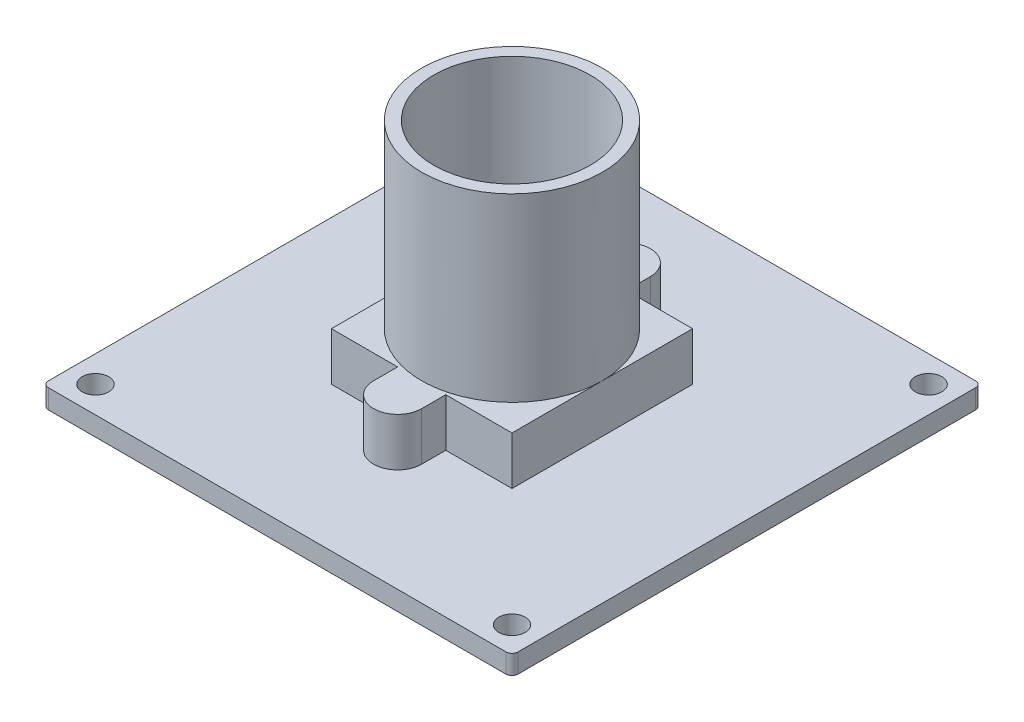
ISO-10303-21;
HEADER;
FILE_DESCRIPTION(('STEP AP214'),'2;1');
FILE_NAME('part.step','',(''),(''),'','','');
FILE_SCHEMA(('AUTOMOTIVE_DESIGN { 1 0 10303 214 1 1 1 1 }'));
ENDSEC;
DATA;
#1=APPLICATION_CONTEXT('core data for automotive mechanical design processes');
#2=APPLICATION_PROTOCOL_DEFINITION('international standard','automotive_design',2000,#1);
#3=PRODUCT_CONTEXT('',#1,'mechanical');
#4=PRODUCT('Part','Part','',(#3));
#5=PRODUCT_RELATED_PRODUCT_CATEGORY('part','',(#4));
#6=PRODUCT_DEFINITION_FORMATION('','',#4);
#7=PRODUCT_DEFINITION_CONTEXT('part definition',#1,'design');
#8=PRODUCT_DEFINITION('design','',#6,#7);
#9=PRODUCT_DEFINITION_SHAPE('','',#8);
#10=(LENGTH_UNIT() NAMED_UNIT(*) SI_UNIT(.MILLI.,.METRE.));
#11=(NAMED_UNIT(*) PLANE_ANGLE_UNIT() SI_UNIT($,.RADIAN.));
#12=(NAMED_UNIT(*) SI_UNIT($,.STERADIAN.) SOLID_ANGLE_UNIT());
#13=UNCERTAINTY_MEASURE_WITH_UNIT(LENGTH_MEASURE(1.E-05),#10,'distance_accuracy_value','');
#14=(GEOMETRIC_REPRESENTATION_CONTEXT(3) GLOBAL_UNCERTAINTY_ASSIGNED_CONTEXT((#13)) GLOBAL_UNIT_ASSIGNED_CONTEXT((#10,
#11,#12)) REPRESENTATION_CONTEXT('',''));
#15=CARTESIAN_POINT('',(0.,0.,0.));
#16=DIRECTION('',(0.,0.,1.));
#17=DIRECTION('',(1.,0.,0.));
#18=AXIS2_PLACEMENT_3D('',#15,#16,#17);
#19=CARTESIAN_POINT('',(0.,2.8,0.));
#20=DIRECTION('',(0.,1.,0.));
#21=DIRECTION('',(0.,0.,1.));
#22=AXIS2_PLACEMENT_3D('',#19,#20,#21);
#23=PLANE('',#22);
#24=DIRECTION('',(0.,0.,-1.));
#25=VECTOR('',#24,1.);
#26=CARTESIAN_POINT('',(3.5,2.8,-3.5));
#27=LINE('',#26,#25);
#28=CARTESIAN_POINT('',(3.5,2.8,3.5));
#29=VERTEX_POINT('',#28);
#30=CARTESIAN_POINT('',(3.5,2.8,-3.5));
#31=VERTEX_POINT('',#30);
#32=EDGE_CURVE('E484',#29,#31,#27,.T.);
#33=ORIENTED_EDGE('',*,*,#32,.T.);
#34=DIRECTION('',(-1.,0.,0.));
#35=VECTOR('',#34,1.);
#36=CARTESIAN_POINT('',(-3.5,2.8,-3.5));
#37=LINE('',#36,#35);
#38=CARTESIAN_POINT('',(-3.5,2.8,-3.5));
#39=VERTEX_POINT('',#38);
#40=EDGE_CURVE('E486',#31,#39,#37,.T.);
#41=ORIENTED_EDGE('',*,*,#40,.T.);
#42=DIRECTION('',(0.,0.,1.));
#43=VECTOR('',#42,1.);
#44=CARTESIAN_POINT('',(-3.5,2.8,-3.5));
#45=LINE('',#44,#43);
#46=CARTESIAN_POINT('',(-3.5,2.8,3.5));
#47=VERTEX_POINT('',#46);
#48=EDGE_CURVE('E489',#39,#47,#45,.T.);
#49=ORIENTED_EDGE('',*,*,#48,.T.);
#50=DIRECTION('',(1.,0.,0.));
#51=VECTOR('',#50,1.);
#52=CARTESIAN_POINT('',(-3.5,2.8,3.5));
#53=LINE('',#52,#51);
#54=EDGE_CURVE('E491',#47,#29,#53,.T.);
#55=ORIENTED_EDGE('',*,*,#54,.T.);
#56=EDGE_LOOP('',(#33,#41,#49,#55));
#57=FACE_BOUND('',#56,.T.);
#58=ADVANCED_FACE('F37',(#57),#23,.T.);
#59=CARTESIAN_POINT('',(-3.5,2.8,-3.5));
#60=DIRECTION('',(1.,0.,0.));
#61=DIRECTION('',(0.,0.,-1.));
#62=AXIS2_PLACEMENT_3D('',#59,#60,#61);
#63=PLANE('',#62);
#64=DIRECTION('',(0.,0.,1.));
#65=VECTOR('',#64,1.);
#66=CARTESIAN_POINT('',(-3.5,0.8,-3.5));
#67=LINE('',#66,#65);
#68=CARTESIAN_POINT('',(-3.5,0.8,-3.5));
#69=VERTEX_POINT('',#68);
#70=CARTESIAN_POINT('',(-3.5,0.8,3.5));
#71=VERTEX_POINT('',#70);
#72=EDGE_CURVE('E498',#69,#71,#67,.T.);
#73=ORIENTED_EDGE('',*,*,#72,.T.);
#74=DIRECTION('',(0.,-1.,0.));
#75=VECTOR('',#74,1.);
#76=CARTESIAN_POINT('',(-3.5,2.8,3.5));
#77=LINE('',#76,#75);
#78=EDGE_CURVE('E504',#47,#71,#77,.T.);
#79=ORIENTED_EDGE('',*,*,#78,.F.);
#80=ORIENTED_EDGE('',*,*,#48,.F.);
#81=DIRECTION('',(0.,-1.,0.));
#82=VECTOR('',#81,1.);
#83=CARTESIAN_POINT('',(-3.5,2.8,-3.5));
#84=LINE('',#83,#82);
#85=EDGE_CURVE('E506',#39,#69,#84,.T.);
#86=ORIENTED_EDGE('',*,*,#85,.T.);
#87=EDGE_LOOP('',(#73,#79,#80,#86));
#88=FACE_BOUND('',#87,.T.);
#89=ADVANCED_FACE('F270',(#88),#63,.F.);
#90=CARTESIAN_POINT('',(-3.5,2.8,3.5));
#91=DIRECTION('',(0.,0.,-1.));
#92=DIRECTION('',(-1.,0.,0.));
#93=AXIS2_PLACEMENT_3D('',#90,#91,#92);
#94=PLANE('',#93);
#95=DIRECTION('',(1.,0.,0.));
#96=VECTOR('',#95,1.);
#97=CARTESIAN_POINT('',(-3.5,0.8,3.5));
#98=LINE('',#97,#96);
#99=CARTESIAN_POINT('',(3.5,0.8,3.5));
#100=VERTEX_POINT('',#99);
#101=EDGE_CURVE('E487',#71,#100,#98,.T.);
#102=ORIENTED_EDGE('',*,*,#101,.T.);
#103=DIRECTION('',(0.,-1.,0.));
#104=VECTOR('',#103,1.);
#105=CARTESIAN_POINT('',(3.5,2.8,3.5));
#106=LINE('',#105,#104);
#107=EDGE_CURVE('E493',#29,#100,#106,.T.);
#108=ORIENTED_EDGE('',*,*,#107,.F.);
#109=ORIENTED_EDGE('',*,*,#54,.F.);
#110=ORIENTED_EDGE('',*,*,#78,.T.);
#111=EDGE_LOOP('',(#102,#108,#109,#110));
#112=FACE_BOUND('',#111,.T.);
#113=ADVANCED_FACE('F277',(#112),#94,.F.);
#114=CARTESIAN_POINT('',(3.5,2.8,-3.5));
#115=DIRECTION('',(-1.,0.,0.));
#116=DIRECTION('',(0.,0.,1.));
#117=AXIS2_PLACEMENT_3D('',#114,#115,#116);
#118=PLANE('',#117);
#119=DIRECTION('',(0.,0.,-1.));
#120=VECTOR('',#119,1.);
#121=CARTESIAN_POINT('',(3.5,0.8,-3.5));
#122=LINE('',#121,#120);
#123=CARTESIAN_POINT('',(3.5,0.8,-3.5));
#124=VERTEX_POINT('',#123);
#125=EDGE_CURVE('E483',#100,#124,#122,.T.);
#126=ORIENTED_EDGE('',*,*,#125,.T.);
#127=DIRECTION('',(0.,-1.,0.));
#128=VECTOR('',#127,1.);
#129=CARTESIAN_POINT('',(3.5,2.8,-3.5));
#130=LINE('',#129,#128);
#131=EDGE_CURVE('E509',#31,#124,#130,.T.);
#132=ORIENTED_EDGE('',*,*,#131,.F.);
#133=ORIENTED_EDGE('',*,*,#32,.F.);
#134=ORIENTED_EDGE('',*,*,#107,.T.);
#135=EDGE_LOOP('',(#126,#132,#133,#134));
#136=FACE_BOUND('',#135,.T.);
#137=ADVANCED_FACE('F286',(#136),#118,.F.);
#138=CARTESIAN_POINT('',(-3.5,2.8,-3.5));
#139=DIRECTION('',(0.,0.,1.));
#140=DIRECTION('',(1.,0.,0.));
#141=AXIS2_PLACEMENT_3D('',#138,#139,#140);
#142=PLANE('',#141);
#143=DIRECTION('',(-1.,0.,0.));
#144=VECTOR('',#143,1.);
#145=CARTESIAN_POINT('',(-3.5,0.8,-3.5));
#146=LINE('',#145,#144);
#147=EDGE_CURVE('E496',#124,#69,#146,.T.);
#148=ORIENTED_EDGE('',*,*,#147,.T.);
#149=ORIENTED_EDGE('',*,*,#85,.F.);
#150=ORIENTED_EDGE('',*,*,#40,.F.);
#151=ORIENTED_EDGE('',*,*,#131,.T.);
#152=EDGE_LOOP('',(#148,#149,#150,#151));
#153=FACE_BOUND('',#152,.T.);
#154=ADVANCED_FACE('F289',(#153),#142,.F.);
#155=CARTESIAN_POINT('',(0.,0.8,0.));
#156=DIRECTION('',(0.,1.,0.));
#157=DIRECTION('',(0.,0.,1.));
#158=AXIS2_PLACEMENT_3D('',#155,#156,#157);
#159=PLANE('',#158);
#160=DIRECTION('',(0.,0.,1.));
#161=VECTOR('',#160,1.);
#162=CARTESIAN_POINT('',(-7.,0.8,7.));
#163=LINE('',#162,#161);
#164=CARTESIAN_POINT('',(-7.,0.8,-7.));
#165=VERTEX_POINT('',#164);
#166=CARTESIAN_POINT('',(-7.,0.8,7.));
#167=VERTEX_POINT('',#166);
#168=EDGE_CURVE('E393',#165,#167,#163,.T.);
#169=ORIENTED_EDGE('',*,*,#168,.T.);
#170=DIRECTION('',(1.,0.,0.));
#171=VECTOR('',#170,1.);
#172=CARTESIAN_POINT('',(7.,0.8,7.));
#173=LINE('',#172,#171);
#174=CARTESIAN_POINT('',(7.,0.8,7.));
#175=VERTEX_POINT('',#174);
#176=EDGE_CURVE('E699',#167,#175,#173,.T.);
#177=ORIENTED_EDGE('',*,*,#176,.T.);
#178=DIRECTION('',(0.,0.,-1.));
#179=VECTOR('',#178,1.);
#180=CARTESIAN_POINT('',(7.,0.8,7.));
#181=LINE('',#180,#179);
#182=CARTESIAN_POINT('',(7.,0.8,-7.));
#183=VERTEX_POINT('',#182);
#184=EDGE_CURVE('E398',#175,#183,#181,.T.);
#185=ORIENTED_EDGE('',*,*,#184,.T.);
#186=DIRECTION('',(-1.,0.,0.));
#187=VECTOR('',#186,1.);
#188=CARTESIAN_POINT('',(7.,0.8,-7.));
#189=LINE('',#188,#187);
#190=EDGE_CURVE('E394',#183,#165,#189,.T.);
#191=ORIENTED_EDGE('',*,*,#190,.T.);
#192=EDGE_LOOP('',(#169,#177,#185,#191));
#193=FACE_BOUND('',#192,.T.);
#194=ORIENTED_EDGE('',*,*,#147,.F.);
#195=ORIENTED_EDGE('',*,*,#125,.F.);
#196=ORIENTED_EDGE('',*,*,#101,.F.);
#197=ORIENTED_EDGE('',*,*,#72,.F.);
#198=EDGE_LOOP('',(#194,#195,#196,#197));
#199=FACE_BOUND('',#198,.T.);
#200=ADVANCED_FACE('F292',(#193,#199),#159,.T.);
#201=CARTESIAN_POINT('',(7.,4.8,-7.));
#202=DIRECTION('',(0.,0.,1.));
#203=DIRECTION('',(1.,0.,0.));
#204=AXIS2_PLACEMENT_3D('',#201,#202,#203);
#205=PLANE('',#204);
#206=DIRECTION('',(0.,-1.,0.));
#207=VECTOR('',#206,1.);
#208=CARTESIAN_POINT('',(7.,4.8,-7.));
#209=LINE('',#208,#207);
#210=CARTESIAN_POINT('',(7.,4.7,-7.));
#211=VERTEX_POINT('',#210);
#212=EDGE_CURVE('E386',#211,#183,#209,.T.);
#213=ORIENTED_EDGE('',*,*,#212,.F.);
#214=DIRECTION('',(-1.,0.,0.));
#215=VECTOR('',#214,1.);
#216=CARTESIAN_POINT('',(7.,4.7,-7.));
#217=LINE('',#216,#215);
#218=CARTESIAN_POINT('',(-7.,4.7,-7.));
#219=VERTEX_POINT('',#218);
#220=EDGE_CURVE('E41',#211,#219,#217,.T.);
#221=ORIENTED_EDGE('',*,*,#220,.T.);
#222=DIRECTION('',(0.,-1.,0.));
#223=VECTOR('',#222,1.);
#224=CARTESIAN_POINT('',(-7.,4.8,-7.));
#225=LINE('',#224,#223);
#226=EDGE_CURVE('E384',#219,#165,#225,.T.);
#227=ORIENTED_EDGE('',*,*,#226,.T.);
#228=ORIENTED_EDGE('',*,*,#190,.F.);
#229=EDGE_LOOP('',(#213,#221,#227,#228));
#230=FACE_BOUND('',#229,.T.);
#231=ADVANCED_FACE('F315',(#230),#205,.T.);
#232=CARTESIAN_POINT('',(7.,4.8,7.));
#233=DIRECTION('',(-1.,0.,0.));
#234=DIRECTION('',(0.,0.,1.));
#235=AXIS2_PLACEMENT_3D('',#232,#233,#234);
#236=PLANE('',#235);
#237=DIRECTION('',(0.,-1.,0.));
#238=VECTOR('',#237,1.);
#239=CARTESIAN_POINT('',(7.,4.8,7.));
#240=LINE('',#239,#238);
#241=CARTESIAN_POINT('',(7.,4.7,7.));
#242=VERTEX_POINT('',#241);
#243=EDGE_CURVE('E396',#242,#175,#240,.T.);
#244=ORIENTED_EDGE('',*,*,#243,.F.);
#245=DIRECTION('',(0.,0.,-1.));
#246=VECTOR('',#245,1.);
#247=CARTESIAN_POINT('',(7.,4.7,7.));
#248=LINE('',#247,#246);
#249=EDGE_CURVE('E691',#242,#211,#248,.T.);
#250=ORIENTED_EDGE('',*,*,#249,.T.);
#251=ORIENTED_EDGE('',*,*,#212,.T.);
#252=ORIENTED_EDGE('',*,*,#184,.F.);
#253=EDGE_LOOP('',(#244,#250,#251,#252));
#254=FACE_BOUND('',#253,.T.);
#255=ADVANCED_FACE('F668',(#254),#236,.T.);
#256=CARTESIAN_POINT('',(7.,4.8,7.));
#257=DIRECTION('',(0.,0.,-1.));
#258=DIRECTION('',(-1.,0.,0.));
#259=AXIS2_PLACEMENT_3D('',#256,#257,#258);
#260=PLANE('',#259);
#261=DIRECTION('',(0.,-1.,0.));
#262=VECTOR('',#261,1.);
#263=CARTESIAN_POINT('',(-7.,4.8,7.));
#264=LINE('',#263,#262);
#265=CARTESIAN_POINT('',(-6.99999999999999,4.7,7.));
#266=VERTEX_POINT('',#265);
#267=EDGE_CURVE('E403',#266,#167,#264,.T.);
#268=ORIENTED_EDGE('',*,*,#267,.F.);
#269=DIRECTION('',(1.,0.,0.));
#270=VECTOR('',#269,1.);
#271=CARTESIAN_POINT('',(7.,4.7,7.));
#272=LINE('',#271,#270);
#273=EDGE_CURVE('E694',#266,#242,#272,.T.);
#274=ORIENTED_EDGE('',*,*,#273,.T.);
#275=ORIENTED_EDGE('',*,*,#243,.T.);
#276=ORIENTED_EDGE('',*,*,#176,.F.);
#277=EDGE_LOOP('',(#268,#274,#275,#276));
#278=FACE_BOUND('',#277,.T.);
#279=ADVANCED_FACE('F665',(#278),#260,.T.);
#280=CARTESIAN_POINT('',(-7.,4.8,7.));
#281=DIRECTION('',(1.,0.,0.));
#282=DIRECTION('',(0.,0.,-1.));
#283=AXIS2_PLACEMENT_3D('',#280,#281,#282);
#284=PLANE('',#283);
#285=ORIENTED_EDGE('',*,*,#226,.F.);
#286=DIRECTION('',(0.,0.,1.));
#287=VECTOR('',#286,1.);
#288=CARTESIAN_POINT('',(-7.,4.7,7.));
#289=LINE('',#288,#287);
#290=EDGE_CURVE('E60',#219,#266,#289,.T.);
#291=ORIENTED_EDGE('',*,*,#290,.T.);
#292=ORIENTED_EDGE('',*,*,#267,.T.);
#293=ORIENTED_EDGE('',*,*,#168,.F.);
#294=EDGE_LOOP('',(#285,#291,#292,#293));
#295=FACE_BOUND('',#294,.T.);
#296=ADVANCED_FACE('F390',(#295),#284,.T.);
#297=CARTESIAN_POINT('',(0.,4.7,0.));
#298=DIRECTION('',(0.,1.,0.));
#299=DIRECTION('',(0.,0.,1.));
#300=AXIS2_PLACEMENT_3D('',#297,#298,#299);
#301=PLANE('',#300);
#302=CARTESIAN_POINT('',(0.,4.7,0.));
#303=DIRECTION('',(0.,1.,0.));
#304=DIRECTION('',(0.,0.,1.));
#305=AXIS2_PLACEMENT_3D('',#302,#303,#304);
#306=CIRCLE('',#305,6.5);
#307=CARTESIAN_POINT('',(0.,4.7,6.5));
#308=VERTEX_POINT('',#307);
#309=EDGE_CURVE('E250',#308,#308,#306,.T.);
#310=ORIENTED_EDGE('',*,*,#309,.T.);
#311=EDGE_LOOP('',(#310));
#312=FACE_BOUND('',#311,.T.);
#313=ORIENTED_EDGE('',*,*,#290,.F.);
#314=ORIENTED_EDGE('',*,*,#220,.F.);
#315=ORIENTED_EDGE('',*,*,#249,.F.);
#316=ORIENTED_EDGE('',*,*,#273,.F.);
#317=EDGE_LOOP('',(#313,#314,#315,#316));
#318=FACE_BOUND('',#317,.T.);
#319=ADVANCED_FACE('F664',(#312,#318),#301,.F.);
#320=CARTESIAN_POINT('',(0.,19.8,0.));
#321=DIRECTION('',(0.,1.,0.));
#322=DIRECTION('',(0.,0.,1.));
#323=AXIS2_PLACEMENT_3D('',#320,#321,#322);
#324=CYLINDRICAL_SURFACE('',#323,6.5);
#325=ORIENTED_EDGE('',*,*,#309,.F.);
#326=EDGE_LOOP('',(#325));
#327=FACE_BOUND('',#326,.T.);
#328=CARTESIAN_POINT('',(0.,19.8,0.));
#329=DIRECTION('',(0.,1.,0.));
#330=DIRECTION('',(0.,0.,1.));
#331=AXIS2_PLACEMENT_3D('',#328,#329,#330);
#332=CIRCLE('',#331,6.5);
#333=CARTESIAN_POINT('',(0.,19.8,6.5));
#334=VERTEX_POINT('',#333);
#335=EDGE_CURVE('E685',#334,#334,#332,.T.);
#336=ORIENTED_EDGE('',*,*,#335,.T.);
#337=EDGE_LOOP('',(#336));
#338=FACE_BOUND('',#337,.T.);
#339=ADVANCED_FACE('F675',(#327,#338),#324,.F.);
#340=CARTESIAN_POINT('',(0.,4.8,-9.5));
#341=DIRECTION('',(0.,1.,0.));
#342=DIRECTION('',(0.,0.,1.));
#343=AXIS2_PLACEMENT_3D('',#340,#341,#342);
#344=PLANE('',#343);
#345=CARTESIAN_POINT('',(0.,4.8,0.));
#346=DIRECTION('',(0.,1.,0.));
#347=DIRECTION('',(0.,0.,1.));
#348=AXIS2_PLACEMENT_3D('',#345,#346,#347);
#349=CIRCLE('',#348,7.5);
#350=CARTESIAN_POINT('',(7.5,4.8,0.));
#351=VERTEX_POINT('',#350);
#352=CARTESIAN_POINT('',(-7.5,4.8,0.));
#353=VERTEX_POINT('',#352);
#354=EDGE_CURVE('E47',#351,#353,#349,.T.);
#355=ORIENTED_EDGE('',*,*,#354,.F.);
#356=DIRECTION('',(0.,0.,-1.));
#357=VECTOR('',#356,1.);
#358=CARTESIAN_POINT('',(7.5,4.8,-7.5));
#359=LINE('',#358,#357);
#360=CARTESIAN_POINT('',(7.5,4.8,-7.5));
#361=VERTEX_POINT('',#360);
#362=EDGE_CURVE('E234',#351,#361,#359,.T.);
#363=ORIENTED_EDGE('',*,*,#362,.T.);
#364=DIRECTION('',(-1.,0.,0.));
#365=VECTOR('',#364,1.);
#366=CARTESIAN_POINT('',(2.,4.8,-7.5));
#367=LINE('',#366,#365);
#368=CARTESIAN_POINT('',(2.,4.8,-7.5));
#369=VERTEX_POINT('',#368);
#370=EDGE_CURVE('E233',#361,#369,#367,.T.);
#371=ORIENTED_EDGE('',*,*,#370,.T.);
#372=DIRECTION('',(0.,0.,-1.));
#373=VECTOR('',#372,1.);
#374=CARTESIAN_POINT('',(2.,4.8,-9.5));
#375=LINE('',#374,#373);
#376=CARTESIAN_POINT('',(2.,4.8,-9.5));
#377=VERTEX_POINT('',#376);
#378=EDGE_CURVE('E409',#369,#377,#375,.T.);
#379=ORIENTED_EDGE('',*,*,#378,.T.);
#380=CARTESIAN_POINT('',(0.,4.8,-9.5));
#381=DIRECTION('',(0.,1.,0.));
#382=DIRECTION('',(0.,0.,1.));
#383=AXIS2_PLACEMENT_3D('',#380,#381,#382);
#384=CIRCLE('',#383,2.);
#385=CARTESIAN_POINT('',(-2.,4.8,-9.5));
#386=VERTEX_POINT('',#385);
#387=EDGE_CURVE('E411',#377,#386,#384,.T.);
#388=ORIENTED_EDGE('',*,*,#387,.T.);
#389=DIRECTION('',(0.,0.,1.));
#390=VECTOR('',#389,1.);
#391=CARTESIAN_POINT('',(-2.,4.8,-9.5));
#392=LINE('',#391,#390);
#393=CARTESIAN_POINT('',(-2.,4.8,-7.5));
#394=VERTEX_POINT('',#393);
#395=EDGE_CURVE('E413',#386,#394,#392,.T.);
#396=ORIENTED_EDGE('',*,*,#395,.T.);
#397=DIRECTION('',(-1.,0.,0.));
#398=VECTOR('',#397,1.);
#399=CARTESIAN_POINT('',(-7.5,4.8,-7.5));
#400=LINE('',#399,#398);
#401=CARTESIAN_POINT('',(-7.5,4.8,-7.5));
#402=VERTEX_POINT('',#401);
#403=EDGE_CURVE('E415',#394,#402,#400,.T.);
#404=ORIENTED_EDGE('',*,*,#403,.T.);
#405=DIRECTION('',(0.,0.,1.));
#406=VECTOR('',#405,1.);
#407=CARTESIAN_POINT('',(-7.5,4.8,-7.5));
#408=LINE('',#407,#406);
#409=EDGE_CURVE('E247',#402,#353,#408,.T.);
#410=ORIENTED_EDGE('',*,*,#409,.T.);
#411=EDGE_LOOP('',(#355,#363,#371,#379,#388,#396,#404,#410));
#412=FACE_BOUND('',#411,.T.);
#413=ADVANCED_FACE('F245',(#412),#344,.T.);
#414=CARTESIAN_POINT('',(17.3,0.8,-17.3));
#415=DIRECTION('',(0.,1.,0.));
#416=DIRECTION('',(0.,0.,-1.));
#417=AXIS2_PLACEMENT_3D('',#414,#415,#416);
#418=CIRCLE('',#417,1.1);
#419=CARTESIAN_POINT('',(17.3,0.8,-18.4));
#420=VERTEX_POINT('',#419);
#421=EDGE_CURVE('E511',#420,#420,#418,.T.);
#422=ORIENTED_EDGE('',*,*,#421,.F.);
#423=EDGE_LOOP('',(#422));
#424=FACE_BOUND('',#423,.T.);
#425=CARTESIAN_POINT('',(17.3,0.8,17.3));
#426=DIRECTION('',(0.,1.,0.));
#427=DIRECTION('',(0.,0.,1.));
#428=AXIS2_PLACEMENT_3D('',#425,#426,#427);
#429=CIRCLE('',#428,1.1);
#430=CARTESIAN_POINT('',(17.3,0.8,18.4));
#431=VERTEX_POINT('',#430);
#432=EDGE_CURVE('E522',#431,#431,#429,.T.);
#433=ORIENTED_EDGE('',*,*,#432,.F.);
#434=EDGE_LOOP('',(#433));
#435=FACE_BOUND('',#434,.T.);
#436=CARTESIAN_POINT('',(-17.3,0.8,17.3));
#437=DIRECTION('',(0.,1.,0.));
#438=DIRECTION('',(0.,0.,-1.));
#439=AXIS2_PLACEMENT_3D('',#436,#437,#438);
#440=CIRCLE('',#439,1.1);
#441=CARTESIAN_POINT('',(-17.3,0.8,16.2));
#442=VERTEX_POINT('',#441);
#443=EDGE_CURVE('E516',#442,#442,#440,.T.);
#444=ORIENTED_EDGE('',*,*,#443,.F.);
#445=EDGE_LOOP('',(#444));
#446=FACE_BOUND('',#445,.T.);
#447=CARTESIAN_POINT('',(-17.3,0.8,-17.3));
#448=DIRECTION('',(0.,1.,0.));
#449=DIRECTION('',(0.,0.,1.));
#450=AXIS2_PLACEMENT_3D('',#447,#448,#449);
#451=CIRCLE('',#450,1.1);
#452=CARTESIAN_POINT('',(-17.3,0.8,-16.2));
#453=VERTEX_POINT('',#452);
#454=EDGE_CURVE('E515',#453,#453,#451,.T.);
#455=ORIENTED_EDGE('',*,*,#454,.F.);
#456=EDGE_LOOP('',(#455));
#457=FACE_BOUND('',#456,.T.);
#458=DIRECTION('',(0.,0.,1.));
#459=VECTOR('',#458,1.);
#460=CARTESIAN_POINT('',(-19.5,0.8,-19.5));
#461=LINE('',#460,#459);
#462=CARTESIAN_POINT('',(-19.5,0.8,-19.));
#463=VERTEX_POINT('',#462);
#464=CARTESIAN_POINT('',(-19.5,0.8,19.));
#465=VERTEX_POINT('',#464);
#466=EDGE_CURVE('E541',#463,#465,#461,.T.);
#467=ORIENTED_EDGE('',*,*,#466,.T.);
#468=CARTESIAN_POINT('',(-19.,0.8,19.));
#469=DIRECTION('',(0.,1.,0.));
#470=DIRECTION('',(0.,0.,1.));
#471=AXIS2_PLACEMENT_3D('',#468,#469,#470);
#472=CIRCLE('',#471,0.5);
#473=CARTESIAN_POINT('',(-19.,0.8,19.5));
#474=VERTEX_POINT('',#473);
#475=EDGE_CURVE('E366',#465,#474,#472,.T.);
#476=ORIENTED_EDGE('',*,*,#475,.T.);
#477=DIRECTION('',(1.,0.,0.));
#478=VECTOR('',#477,1.);
#479=CARTESIAN_POINT('',(-19.5,0.8,19.5));
#480=LINE('',#479,#478);
#481=CARTESIAN_POINT('',(19.,0.8,19.5));
#482=VERTEX_POINT('',#481);
#483=EDGE_CURVE('E544',#474,#482,#480,.T.);
#484=ORIENTED_EDGE('',*,*,#483,.T.);
#485=CARTESIAN_POINT('',(19.,0.8,19.));
#486=DIRECTION('',(0.,1.,0.));
#487=DIRECTION('',(0.,0.,1.));
#488=AXIS2_PLACEMENT_3D('',#485,#486,#487);
#489=CIRCLE('',#488,0.5);
#490=CARTESIAN_POINT('',(19.5,0.8,19.));
#491=VERTEX_POINT('',#490);
#492=EDGE_CURVE('E363',#482,#491,#489,.T.);
#493=ORIENTED_EDGE('',*,*,#492,.T.);
#494=DIRECTION('',(0.,0.,-1.));
#495=VECTOR('',#494,1.);
#496=CARTESIAN_POINT('',(19.5,0.8,-19.5));
#497=LINE('',#496,#495);
#498=CARTESIAN_POINT('',(19.5,0.8,-19.));
#499=VERTEX_POINT('',#498);
#500=EDGE_CURVE('E536',#491,#499,#497,.T.);
#501=ORIENTED_EDGE('',*,*,#500,.T.);
#502=CARTESIAN_POINT('',(19.,0.8,-19.));
#503=DIRECTION('',(0.,1.,0.));
#504=DIRECTION('',(0.,0.,1.));
#505=AXIS2_PLACEMENT_3D('',#502,#503,#504);
#506=CIRCLE('',#505,0.5);
#507=CARTESIAN_POINT('',(19.,0.8,-19.5));
#508=VERTEX_POINT('',#507);
#509=EDGE_CURVE('E355',#499,#508,#506,.T.);
#510=ORIENTED_EDGE('',*,*,#509,.T.);
#511=DIRECTION('',(-1.,0.,0.));
#512=VECTOR('',#511,1.);
#513=CARTESIAN_POINT('',(-19.5,0.8,-19.5));
#514=LINE('',#513,#512);
#515=CARTESIAN_POINT('',(-19.,0.8,-19.5));
#516=VERTEX_POINT('',#515);
#517=EDGE_CURVE('E538',#508,#516,#514,.T.);
#518=ORIENTED_EDGE('',*,*,#517,.T.);
#519=CARTESIAN_POINT('',(-19.,0.8,-19.));
#520=DIRECTION('',(0.,1.,0.));
#521=DIRECTION('',(0.,0.,1.));
#522=AXIS2_PLACEMENT_3D('',#519,#520,#521);
#523=CIRCLE('',#522,0.5);
#524=EDGE_CURVE('E364',#516,#463,#523,.T.);
#525=ORIENTED_EDGE('',*,*,#524,.T.);
#526=EDGE_LOOP('',(#467,#476,#484,#493,#501,#510,#518,#525));
#527=FACE_BOUND('',#526,.T.);
#528=DIRECTION('',(0.,0.,-1.));
#529=VECTOR('',#528,1.);
#530=CARTESIAN_POINT('',(7.5,0.8,-7.5));
#531=LINE('',#530,#529);
#532=CARTESIAN_POINT('',(7.5,0.8,7.5));
#533=VERTEX_POINT('',#532);
#534=CARTESIAN_POINT('',(7.5,0.8,-7.5));
#535=VERTEX_POINT('',#534);
#536=EDGE_CURVE('E430',#533,#535,#531,.T.);
#537=ORIENTED_EDGE('',*,*,#536,.F.);
#538=DIRECTION('',(1.,0.,0.));
#539=VECTOR('',#538,1.);
#540=CARTESIAN_POINT('',(1.99999999999999,0.8,7.5));
#541=LINE('',#540,#539);
#542=CARTESIAN_POINT('',(1.99999999999999,0.8,7.5));
#543=VERTEX_POINT('',#542);
#544=EDGE_CURVE('E405',#543,#533,#541,.T.);
#545=ORIENTED_EDGE('',*,*,#544,.F.);
#546=DIRECTION('',(0.,0.,-1.));
#547=VECTOR('',#546,1.);
#548=CARTESIAN_POINT('',(1.99999999999999,0.8,9.5));
#549=LINE('',#548,#547);
#550=CARTESIAN_POINT('',(1.99999999999999,0.8,9.5));
#551=VERTEX_POINT('',#550);
#552=EDGE_CURVE('E406',#551,#543,#549,.T.);
#553=ORIENTED_EDGE('',*,*,#552,.F.);
#554=CARTESIAN_POINT('',(0.,0.8,9.5));
#555=DIRECTION('',(0.,1.,0.));
#556=DIRECTION('',(0.,0.,-1.));
#557=AXIS2_PLACEMENT_3D('',#554,#555,#556);
#558=CIRCLE('',#557,2.);
#559=CARTESIAN_POINT('',(-2.00000000000001,0.8,9.5));
#560=VERTEX_POINT('',#559);
#561=EDGE_CURVE('E453',#560,#551,#558,.T.);
#562=ORIENTED_EDGE('',*,*,#561,.F.);
#563=DIRECTION('',(0.,0.,1.));
#564=VECTOR('',#563,1.);
#565=CARTESIAN_POINT('',(-2.00000000000001,0.8,9.5));
#566=LINE('',#565,#564);
#567=CARTESIAN_POINT('',(-2.00000000000001,0.8,7.5));
#568=VERTEX_POINT('',#567);
#569=EDGE_CURVE('E451',#568,#560,#566,.T.);
#570=ORIENTED_EDGE('',*,*,#569,.F.);
#571=DIRECTION('',(1.,0.,0.));
#572=VECTOR('',#571,1.);
#573=CARTESIAN_POINT('',(-7.5,0.8,7.5));
#574=LINE('',#573,#572);
#575=CARTESIAN_POINT('',(-7.5,0.8,7.5));
#576=VERTEX_POINT('',#575);
#577=EDGE_CURVE('E448',#576,#568,#574,.T.);
#578=ORIENTED_EDGE('',*,*,#577,.F.);
#579=DIRECTION('',(0.,0.,1.));
#580=VECTOR('',#579,1.);
#581=CARTESIAN_POINT('',(-7.5,0.8,-7.5));
#582=LINE('',#581,#580);
#583=CARTESIAN_POINT('',(-7.5,0.8,-7.5));
#584=VERTEX_POINT('',#583);
#585=EDGE_CURVE('E445',#584,#576,#582,.T.);
#586=ORIENTED_EDGE('',*,*,#585,.F.);
#587=DIRECTION('',(-1.,0.,0.));
#588=VECTOR('',#587,1.);
#589=CARTESIAN_POINT('',(-7.5,0.8,-7.5));
#590=LINE('',#589,#588);
#591=CARTESIAN_POINT('',(-2.,0.8,-7.5));
#592=VERTEX_POINT('',#591);
#593=EDGE_CURVE('E442',#592,#584,#590,.T.);
#594=ORIENTED_EDGE('',*,*,#593,.F.);
#595=DIRECTION('',(0.,0.,1.));
#596=VECTOR('',#595,1.);
#597=CARTESIAN_POINT('',(-2.,0.8,-9.5));
#598=LINE('',#597,#596);
#599=CARTESIAN_POINT('',(-2.,0.8,-9.5));
#600=VERTEX_POINT('',#599);
#601=EDGE_CURVE('E439',#600,#592,#598,.T.);
#602=ORIENTED_EDGE('',*,*,#601,.F.);
#603=CARTESIAN_POINT('',(0.,0.8,-9.5));
#604=DIRECTION('',(0.,1.,0.));
#605=DIRECTION('',(0.,0.,1.));
#606=AXIS2_PLACEMENT_3D('',#603,#604,#605);
#607=CIRCLE('',#606,2.);
#608=CARTESIAN_POINT('',(2.,0.8,-9.5));
#609=VERTEX_POINT('',#608);
#610=EDGE_CURVE('E437',#609,#600,#607,.T.);
#611=ORIENTED_EDGE('',*,*,#610,.F.);
#612=DIRECTION('',(0.,0.,-1.));
#613=VECTOR('',#612,1.);
#614=CARTESIAN_POINT('',(2.,0.8,-9.5));
#615=LINE('',#614,#613);
#616=CARTESIAN_POINT('',(2.,0.8,-7.5));
#617=VERTEX_POINT('',#616);
#618=EDGE_CURVE('E435',#617,#609,#615,.T.);
#619=ORIENTED_EDGE('',*,*,#618,.F.);
#620=DIRECTION('',(-1.,0.,0.));
#621=VECTOR('',#620,1.);
#622=CARTESIAN_POINT('',(2.,0.8,-7.5));
#623=LINE('',#622,#621);
#624=EDGE_CURVE('E432',#535,#617,#623,.T.);
#625=ORIENTED_EDGE('',*,*,#624,.F.);
#626=EDGE_LOOP('',(#537,#545,#553,#562,#570,#578,#586,#594,#602,#611,#619,#625));
#627=FACE_BOUND('',#626,.T.);
#628=ADVANCED_FACE('F317',(#424,#435,#446,#457,#527,#627),#159,.T.);
#629=CARTESIAN_POINT('',(19.5,0.8,-19.5));
#630=DIRECTION('',(-1.,0.,0.));
#631=DIRECTION('',(0.,0.,1.));
#632=AXIS2_PLACEMENT_3D('',#629,#630,#631);
#633=PLANE('',#632);
#634=ORIENTED_EDGE('',*,*,#500,.F.);
#635=DIRECTION('',(0.,-1.,0.));
#636=VECTOR('',#635,1.);
#637=CARTESIAN_POINT('',(19.5,0.8,19.));
#638=LINE('',#637,#636);
#639=CARTESIAN_POINT('',(19.5,-0.8,19.));
#640=VERTEX_POINT('',#639);
#641=EDGE_CURVE('E374',#491,#640,#638,.T.);
#642=ORIENTED_EDGE('',*,*,#641,.T.);
#643=DIRECTION('',(0.,0.,-1.));
#644=VECTOR('',#643,1.);
#645=CARTESIAN_POINT('',(19.5,-0.8,-19.5));
#646=LINE('',#645,#644);
#647=CARTESIAN_POINT('',(19.5,-0.8,-19.));
#648=VERTEX_POINT('',#647);
#649=EDGE_CURVE('E533',#640,#648,#646,.T.);
#650=ORIENTED_EDGE('',*,*,#649,.T.);
#651=DIRECTION('',(0.,-1.,0.));
#652=VECTOR('',#651,1.);
#653=CARTESIAN_POINT('',(19.5,0.8,-19.));
#654=LINE('',#653,#652);
#655=EDGE_CURVE('E356',#648,#499,#654,.F.);
#656=ORIENTED_EDGE('',*,*,#655,.T.);
#657=EDGE_LOOP('',(#634,#642,#650,#656));
#658=FACE_BOUND('',#657,.T.);
#659=ADVANCED_FACE('F334',(#658),#633,.F.);
#660=CARTESIAN_POINT('',(-19.5,0.8,-19.5));
#661=DIRECTION('',(0.,0.,1.));
#662=DIRECTION('',(1.,0.,0.));
#663=AXIS2_PLACEMENT_3D('',#660,#661,#662);
#664=PLANE('',#663);
#665=ORIENTED_EDGE('',*,*,#517,.F.);
#666=DIRECTION('',(0.,-1.,0.));
#667=VECTOR('',#666,1.);
#668=CARTESIAN_POINT('',(19.,0.8,-19.5));
#669=LINE('',#668,#667);
#670=CARTESIAN_POINT('',(19.,-0.8,-19.5));
#671=VERTEX_POINT('',#670);
#672=EDGE_CURVE('E358',#508,#671,#669,.T.);
#673=ORIENTED_EDGE('',*,*,#672,.T.);
#674=DIRECTION('',(-1.,0.,0.));
#675=VECTOR('',#674,1.);
#676=CARTESIAN_POINT('',(-19.5,-0.8,-19.5));
#677=LINE('',#676,#675);
#678=CARTESIAN_POINT('',(-19.,-0.8,-19.5));
#679=VERTEX_POINT('',#678);
#680=EDGE_CURVE('E550',#671,#679,#677,.T.);
#681=ORIENTED_EDGE('',*,*,#680,.T.);
#682=DIRECTION('',(0.,-1.,0.));
#683=VECTOR('',#682,1.);
#684=CARTESIAN_POINT('',(-19.,0.8,-19.5));
#685=LINE('',#684,#683);
#686=EDGE_CURVE('E377',#679,#516,#685,.F.);
#687=ORIENTED_EDGE('',*,*,#686,.T.);
#688=EDGE_LOOP('',(#665,#673,#681,#687));
#689=FACE_BOUND('',#688,.T.);
#690=ADVANCED_FACE('F330',(#689),#664,.F.);
#691=CARTESIAN_POINT('',(-19.5,0.8,-19.5));
#692=DIRECTION('',(1.,0.,0.));
#693=DIRECTION('',(0.,0.,-1.));
#694=AXIS2_PLACEMENT_3D('',#691,#692,#693);
#695=PLANE('',#694);
#696=DIRECTION('',(0.,0.,1.));
#697=VECTOR('',#696,1.);
#698=CARTESIAN_POINT('',(-19.5,-0.8,-19.5));
#699=LINE('',#698,#697);
#700=CARTESIAN_POINT('',(-19.5,-0.8,-19.));
#701=VERTEX_POINT('',#700);
#702=CARTESIAN_POINT('',(-19.5,-0.8,19.));
#703=VERTEX_POINT('',#702);
#704=EDGE_CURVE('E552',#701,#703,#699,.T.);
#705=ORIENTED_EDGE('',*,*,#704,.T.);
#706=DIRECTION('',(0.,-1.,0.));
#707=VECTOR('',#706,1.);
#708=CARTESIAN_POINT('',(-19.5,0.8,19.));
#709=LINE('',#708,#707);
#710=EDGE_CURVE('E368',#703,#465,#709,.F.);
#711=ORIENTED_EDGE('',*,*,#710,.T.);
#712=ORIENTED_EDGE('',*,*,#466,.F.);
#713=DIRECTION('',(0.,-1.,0.));
#714=VECTOR('',#713,1.);
#715=CARTESIAN_POINT('',(-19.5,0.8,-19.));
#716=LINE('',#715,#714);
#717=EDGE_CURVE('E569',#463,#701,#716,.T.);
#718=ORIENTED_EDGE('',*,*,#717,.T.);
#719=EDGE_LOOP('',(#705,#711,#712,#718));
#720=FACE_BOUND('',#719,.T.);
#721=ADVANCED_FACE('F326',(#720),#695,.F.);
#722=CARTESIAN_POINT('',(-19.5,0.8,19.5));
#723=DIRECTION('',(0.,0.,-1.));
#724=DIRECTION('',(-1.,0.,0.));
#725=AXIS2_PLACEMENT_3D('',#722,#723,#724);
#726=PLANE('',#725);
#727=ORIENTED_EDGE('',*,*,#483,.F.);
#728=DIRECTION('',(0.,-1.,0.));
#729=VECTOR('',#728,1.);
#730=CARTESIAN_POINT('',(-19.,0.8,19.5));
#731=LINE('',#730,#729);
#732=CARTESIAN_POINT('',(-19.,-0.8,19.5));
#733=VERTEX_POINT('',#732);
#734=EDGE_CURVE('E558',#474,#733,#731,.T.);
#735=ORIENTED_EDGE('',*,*,#734,.T.);
#736=DIRECTION('',(1.,0.,0.));
#737=VECTOR('',#736,1.);
#738=CARTESIAN_POINT('',(-19.5,-0.8,19.5));
#739=LINE('',#738,#737);
#740=CARTESIAN_POINT('',(19.,-0.8,19.5));
#741=VERTEX_POINT('',#740);
#742=EDGE_CURVE('E539',#733,#741,#739,.T.);
#743=ORIENTED_EDGE('',*,*,#742,.T.);
#744=DIRECTION('',(0.,-1.,0.));
#745=VECTOR('',#744,1.);
#746=CARTESIAN_POINT('',(19.,0.8,19.5));
#747=LINE('',#746,#745);
#748=EDGE_CURVE('E547',#741,#482,#747,.F.);
#749=ORIENTED_EDGE('',*,*,#748,.T.);
#750=EDGE_LOOP('',(#727,#735,#743,#749));
#751=FACE_BOUND('',#750,.T.);
#752=ADVANCED_FACE('F322',(#751),#726,.F.);
#753=CARTESIAN_POINT('',(0.,-0.8,0.));
#754=DIRECTION('',(0.,1.,0.));
#755=DIRECTION('',(0.,0.,1.));
#756=AXIS2_PLACEMENT_3D('',#753,#754,#755);
#757=PLANE('',#756);
#758=CARTESIAN_POINT('',(17.3,-0.8,-17.3));
#759=DIRECTION('',(0.,1.,0.));
#760=DIRECTION('',(0.,0.,-1.));
#761=AXIS2_PLACEMENT_3D('',#758,#759,#760);
#762=CIRCLE('',#761,1.1);
#763=CARTESIAN_POINT('',(17.3,-0.8,-18.4));
#764=VERTEX_POINT('',#763);
#765=EDGE_CURVE('E525',#764,#764,#762,.T.);
#766=ORIENTED_EDGE('',*,*,#765,.T.);
#767=EDGE_LOOP('',(#766));
#768=FACE_BOUND('',#767,.T.);
#769=CARTESIAN_POINT('',(17.3,-0.8,17.3));
#770=DIRECTION('',(0.,1.,0.));
#771=DIRECTION('',(0.,0.,1.));
#772=AXIS2_PLACEMENT_3D('',#769,#770,#771);
#773=CIRCLE('',#772,1.1);
#774=CARTESIAN_POINT('',(17.3,-0.8,18.4));
#775=VERTEX_POINT('',#774);
#776=EDGE_CURVE('E519',#775,#775,#773,.T.);
#777=ORIENTED_EDGE('',*,*,#776,.T.);
#778=EDGE_LOOP('',(#777));
#779=FACE_BOUND('',#778,.T.);
#780=CARTESIAN_POINT('',(-17.3,-0.8,17.3));
#781=DIRECTION('',(0.,1.,0.));
#782=DIRECTION('',(0.,0.,-1.));
#783=AXIS2_PLACEMENT_3D('',#780,#781,#782);
#784=CIRCLE('',#783,1.1);
#785=CARTESIAN_POINT('',(-17.3,-0.8,16.2));
#786=VERTEX_POINT('',#785);
#787=EDGE_CURVE('E512',#786,#786,#784,.T.);
#788=ORIENTED_EDGE('',*,*,#787,.T.);
#789=EDGE_LOOP('',(#788));
#790=FACE_BOUND('',#789,.T.);
#791=CARTESIAN_POINT('',(-17.3,-0.8,-17.3));
#792=DIRECTION('',(0.,1.,0.));
#793=DIRECTION('',(0.,0.,1.));
#794=AXIS2_PLACEMENT_3D('',#791,#792,#793);
#795=CIRCLE('',#794,1.1);
#796=CARTESIAN_POINT('',(-17.3,-0.8,-16.2));
#797=VERTEX_POINT('',#796);
#798=EDGE_CURVE('E530',#797,#797,#795,.T.);
#799=ORIENTED_EDGE('',*,*,#798,.T.);
#800=EDGE_LOOP('',(#799));
#801=FACE_BOUND('',#800,.T.);
#802=ORIENTED_EDGE('',*,*,#742,.F.);
#803=CARTESIAN_POINT('',(-19.,-0.8,19.));
#804=DIRECTION('',(0.,1.,0.));
#805=DIRECTION('',(0.,0.,1.));
#806=AXIS2_PLACEMENT_3D('',#803,#804,#805);
#807=CIRCLE('',#806,0.5);
#808=EDGE_CURVE('E567',#733,#703,#807,.F.);
#809=ORIENTED_EDGE('',*,*,#808,.T.);
#810=ORIENTED_EDGE('',*,*,#704,.F.);
#811=CARTESIAN_POINT('',(-19.,-0.8,-19.));
#812=DIRECTION('',(0.,1.,0.));
#813=DIRECTION('',(0.,0.,1.));
#814=AXIS2_PLACEMENT_3D('',#811,#812,#813);
#815=CIRCLE('',#814,0.5);
#816=EDGE_CURVE('E561',#701,#679,#815,.F.);
#817=ORIENTED_EDGE('',*,*,#816,.T.);
#818=ORIENTED_EDGE('',*,*,#680,.F.);
#819=CARTESIAN_POINT('',(19.,-0.8,-19.));
#820=DIRECTION('',(0.,1.,0.));
#821=DIRECTION('',(0.,0.,1.));
#822=AXIS2_PLACEMENT_3D('',#819,#820,#821);
#823=CIRCLE('',#822,0.5);
#824=EDGE_CURVE('E563',#671,#648,#823,.F.);
#825=ORIENTED_EDGE('',*,*,#824,.T.);
#826=ORIENTED_EDGE('',*,*,#649,.F.);
#827=CARTESIAN_POINT('',(19.,-0.8,19.));
#828=DIRECTION('',(0.,1.,0.));
#829=DIRECTION('',(0.,0.,1.));
#830=AXIS2_PLACEMENT_3D('',#827,#828,#829);
#831=CIRCLE('',#830,0.5);
#832=EDGE_CURVE('E565',#640,#741,#831,.F.);
#833=ORIENTED_EDGE('',*,*,#832,.T.);
#834=EDGE_LOOP('',(#802,#809,#810,#817,#818,#825,#826,#833));
#835=FACE_BOUND('',#834,.T.);
#836=ADVANCED_FACE('F318',(#768,#779,#790,#801,#835),#757,.F.);
#837=CARTESIAN_POINT('',(-19.,0.8,19.));
#838=DIRECTION('',(0.,-1.,0.));
#839=DIRECTION('',(0.,0.,-1.));
#840=AXIS2_PLACEMENT_3D('',#837,#838,#839);
#841=CYLINDRICAL_SURFACE('',#840,0.5);
#842=ORIENTED_EDGE('',*,*,#475,.F.);
#843=ORIENTED_EDGE('',*,*,#710,.F.);
#844=ORIENTED_EDGE('',*,*,#808,.F.);
#845=ORIENTED_EDGE('',*,*,#734,.F.);
#846=EDGE_LOOP('',(#842,#843,#844,#845));
#847=FACE_BOUND('',#846,.T.);
#848=ADVANCED_FACE('F321',(#847),#841,.T.);
#849=CARTESIAN_POINT('',(19.,0.8,19.));
#850=DIRECTION('',(0.,-1.,0.));
#851=DIRECTION('',(0.,0.,-1.));
#852=AXIS2_PLACEMENT_3D('',#849,#850,#851);
#853=CYLINDRICAL_SURFACE('',#852,0.5);
#854=ORIENTED_EDGE('',*,*,#492,.F.);
#855=ORIENTED_EDGE('',*,*,#748,.F.);
#856=ORIENTED_EDGE('',*,*,#832,.F.);
#857=ORIENTED_EDGE('',*,*,#641,.F.);
#858=EDGE_LOOP('',(#854,#855,#856,#857));
#859=FACE_BOUND('',#858,.T.);
#860=ADVANCED_FACE('F341',(#859),#853,.T.);
#861=CARTESIAN_POINT('',(19.,0.8,-19.));
#862=DIRECTION('',(0.,-1.,0.));
#863=DIRECTION('',(0.,0.,-1.));
#864=AXIS2_PLACEMENT_3D('',#861,#862,#863);
#865=CYLINDRICAL_SURFACE('',#864,0.5);
#866=ORIENTED_EDGE('',*,*,#509,.F.);
#867=ORIENTED_EDGE('',*,*,#655,.F.);
#868=ORIENTED_EDGE('',*,*,#824,.F.);
#869=ORIENTED_EDGE('',*,*,#672,.F.);
#870=EDGE_LOOP('',(#866,#867,#868,#869));
#871=FACE_BOUND('',#870,.T.);
#872=ADVANCED_FACE('F344',(#871),#865,.T.);
#873=CARTESIAN_POINT('',(-19.,0.8,-19.));
#874=DIRECTION('',(0.,-1.,0.));
#875=DIRECTION('',(0.,0.,-1.));
#876=AXIS2_PLACEMENT_3D('',#873,#874,#875);
#877=CYLINDRICAL_SURFACE('',#876,0.5);
#878=ORIENTED_EDGE('',*,*,#524,.F.);
#879=ORIENTED_EDGE('',*,*,#686,.F.);
#880=ORIENTED_EDGE('',*,*,#816,.F.);
#881=ORIENTED_EDGE('',*,*,#717,.F.);
#882=EDGE_LOOP('',(#878,#879,#880,#881));
#883=FACE_BOUND('',#882,.T.);
#884=ADVANCED_FACE('F39',(#883),#877,.T.);
#885=CARTESIAN_POINT('',(-17.3,-0.8,-17.3));
#886=DIRECTION('',(0.,1.,0.));
#887=DIRECTION('',(0.,0.,1.));
#888=AXIS2_PLACEMENT_3D('',#885,#886,#887);
#889=CYLINDRICAL_SURFACE('',#888,1.1);
#890=ORIENTED_EDGE('',*,*,#798,.F.);
#891=EDGE_LOOP('',(#890));
#892=FACE_BOUND('',#891,.T.);
#893=ORIENTED_EDGE('',*,*,#454,.T.);
#894=EDGE_LOOP('',(#893));
#895=FACE_BOUND('',#894,.T.);
#896=ADVANCED_FACE('F301',(#892,#895),#889,.F.);
#897=CARTESIAN_POINT('',(-17.3,-0.8,17.3));
#898=DIRECTION('',(0.,1.,0.));
#899=DIRECTION('',(0.,0.,1.));
#900=AXIS2_PLACEMENT_3D('',#897,#898,#899);
#901=CYLINDRICAL_SURFACE('',#900,1.1);
#902=ORIENTED_EDGE('',*,*,#787,.F.);
#903=EDGE_LOOP('',(#902));
#904=FACE_BOUND('',#903,.T.);
#905=ORIENTED_EDGE('',*,*,#443,.T.);
#906=EDGE_LOOP('',(#905));
#907=FACE_BOUND('',#906,.T.);
#908=ADVANCED_FACE('F297',(#904,#907),#901,.F.);
#909=CARTESIAN_POINT('',(17.3,-0.8,17.3));
#910=DIRECTION('',(0.,1.,0.));
#911=DIRECTION('',(0.,0.,1.));
#912=AXIS2_PLACEMENT_3D('',#909,#910,#911);
#913=CYLINDRICAL_SURFACE('',#912,1.1);
#914=ORIENTED_EDGE('',*,*,#776,.F.);
#915=EDGE_LOOP('',(#914));
#916=FACE_BOUND('',#915,.T.);
#917=ORIENTED_EDGE('',*,*,#432,.T.);
#918=EDGE_LOOP('',(#917));
#919=FACE_BOUND('',#918,.T.);
#920=ADVANCED_FACE('F300',(#916,#919),#913,.F.);
#921=CARTESIAN_POINT('',(17.3,-0.8,-17.3));
#922=DIRECTION('',(0.,1.,0.));
#923=DIRECTION('',(0.,0.,1.));
#924=AXIS2_PLACEMENT_3D('',#921,#922,#923);
#925=CYLINDRICAL_SURFACE('',#924,1.1);
#926=ORIENTED_EDGE('',*,*,#765,.F.);
#927=EDGE_LOOP('',(#926));
#928=FACE_BOUND('',#927,.T.);
#929=ORIENTED_EDGE('',*,*,#421,.T.);
#930=EDGE_LOOP('',(#929));
#931=FACE_BOUND('',#930,.T.);
#932=ADVANCED_FACE('F305',(#928,#931),#925,.F.);
#933=EDGE_CURVE('E11',#353,#351,#349,.T.);
#934=ORIENTED_EDGE('',*,*,#933,.F.);
#935=CARTESIAN_POINT('',(-7.5,4.8,7.5));
#936=VERTEX_POINT('',#935);
#937=EDGE_CURVE('E417',#353,#936,#408,.T.);
#938=ORIENTED_EDGE('',*,*,#937,.T.);
#939=DIRECTION('',(1.,0.,0.));
#940=VECTOR('',#939,1.);
#941=CARTESIAN_POINT('',(-7.5,4.8,7.5));
#942=LINE('',#941,#940);
#943=CARTESIAN_POINT('',(-2.00000000000001,4.8,7.5));
#944=VERTEX_POINT('',#943);
#945=EDGE_CURVE('E419',#936,#944,#942,.T.);
#946=ORIENTED_EDGE('',*,*,#945,.T.);
#947=DIRECTION('',(0.,0.,1.));
#948=VECTOR('',#947,1.);
#949=CARTESIAN_POINT('',(-2.00000000000001,4.8,9.5));
#950=LINE('',#949,#948);
#951=CARTESIAN_POINT('',(-2.00000000000001,4.8,9.5));
#952=VERTEX_POINT('',#951);
#953=EDGE_CURVE('E421',#944,#952,#950,.T.);
#954=ORIENTED_EDGE('',*,*,#953,.T.);
#955=CARTESIAN_POINT('',(0.,4.8,9.5));
#956=DIRECTION('',(0.,1.,0.));
#957=DIRECTION('',(0.,0.,-1.));
#958=AXIS2_PLACEMENT_3D('',#955,#956,#957);
#959=CIRCLE('',#958,2.);
#960=CARTESIAN_POINT('',(1.99999999999999,4.8,9.5));
#961=VERTEX_POINT('',#960);
#962=EDGE_CURVE('E423',#952,#961,#959,.T.);
#963=ORIENTED_EDGE('',*,*,#962,.T.);
#964=DIRECTION('',(0.,0.,-1.));
#965=VECTOR('',#964,1.);
#966=CARTESIAN_POINT('',(1.99999999999999,4.8,9.5));
#967=LINE('',#966,#965);
#968=CARTESIAN_POINT('',(1.99999999999999,4.8,7.5));
#969=VERTEX_POINT('',#968);
#970=EDGE_CURVE('E425',#961,#969,#967,.T.);
#971=ORIENTED_EDGE('',*,*,#970,.T.);
#972=DIRECTION('',(1.,0.,0.));
#973=VECTOR('',#972,1.);
#974=CARTESIAN_POINT('',(1.99999999999999,4.8,7.5));
#975=LINE('',#974,#973);
#976=CARTESIAN_POINT('',(7.5,4.8,7.5));
#977=VERTEX_POINT('',#976);
#978=EDGE_CURVE('E230',#969,#977,#975,.T.);
#979=ORIENTED_EDGE('',*,*,#978,.T.);
#980=EDGE_CURVE('E226',#977,#351,#359,.T.);
#981=ORIENTED_EDGE('',*,*,#980,.T.);
#982=EDGE_LOOP('',(#934,#938,#946,#954,#963,#971,#979,#981));
#983=FACE_BOUND('',#982,.T.);
#984=ADVANCED_FACE('F228',(#983),#344,.T.);
#985=CARTESIAN_POINT('',(1.99999999999999,4.8,7.5));
#986=DIRECTION('',(0.,0.,-1.));
#987=DIRECTION('',(-1.,0.,0.));
#988=AXIS2_PLACEMENT_3D('',#985,#986,#987);
#989=PLANE('',#988);
#990=DIRECTION('',(0.,-1.,0.));
#991=VECTOR('',#990,1.);
#992=CARTESIAN_POINT('',(1.99999999999999,4.8,7.5));
#993=LINE('',#992,#991);
#994=EDGE_CURVE('E427',#969,#543,#993,.T.);
#995=ORIENTED_EDGE('',*,*,#994,.T.);
#996=ORIENTED_EDGE('',*,*,#544,.T.);
#997=DIRECTION('',(0.,-1.,0.));
#998=VECTOR('',#997,1.);
#999=CARTESIAN_POINT('',(7.5,4.8,7.5));
#1000=LINE('',#999,#998);
#1001=EDGE_CURVE('E481',#977,#533,#1000,.T.);
#1002=ORIENTED_EDGE('',*,*,#1001,.F.);
#1003=ORIENTED_EDGE('',*,*,#978,.F.);
#1004=EDGE_LOOP('',(#995,#996,#1002,#1003));
#1005=FACE_BOUND('',#1004,.T.);
#1006=ADVANCED_FACE('F283',(#1005),#989,.F.);
#1007=CARTESIAN_POINT('',(7.5,4.8,-7.5));
#1008=DIRECTION('',(-1.,0.,0.));
#1009=DIRECTION('',(0.,0.,1.));
#1010=AXIS2_PLACEMENT_3D('',#1007,#1008,#1009);
#1011=PLANE('',#1010);
#1012=ORIENTED_EDGE('',*,*,#1001,.T.);
#1013=ORIENTED_EDGE('',*,*,#536,.T.);
#1014=DIRECTION('',(0.,-1.,0.));
#1015=VECTOR('',#1014,1.);
#1016=CARTESIAN_POINT('',(7.5,4.8,-7.5));
#1017=LINE('',#1016,#1015);
#1018=EDGE_CURVE('E240',#361,#535,#1017,.T.);
#1019=ORIENTED_EDGE('',*,*,#1018,.F.);
#1020=ORIENTED_EDGE('',*,*,#362,.F.);
#1021=ORIENTED_EDGE('',*,*,#980,.F.);
#1022=EDGE_LOOP('',(#1012,#1013,#1019,#1020,#1021));
#1023=FACE_BOUND('',#1022,.T.);
#1024=ADVANCED_FACE('F238',(#1023),#1011,.F.);
#1025=CARTESIAN_POINT('',(2.,4.8,-7.5));
#1026=DIRECTION('',(0.,0.,1.));
#1027=DIRECTION('',(1.,0.,0.));
#1028=AXIS2_PLACEMENT_3D('',#1025,#1026,#1027);
#1029=PLANE('',#1028);
#1030=ORIENTED_EDGE('',*,*,#1018,.T.);
#1031=ORIENTED_EDGE('',*,*,#624,.T.);
#1032=DIRECTION('',(0.,-1.,0.));
#1033=VECTOR('',#1032,1.);
#1034=CARTESIAN_POINT('',(2.,4.8,-7.5));
#1035=LINE('',#1034,#1033);
#1036=EDGE_CURVE('E478',#369,#617,#1035,.T.);
#1037=ORIENTED_EDGE('',*,*,#1036,.F.);
#1038=ORIENTED_EDGE('',*,*,#370,.F.);
#1039=EDGE_LOOP('',(#1030,#1031,#1037,#1038));
#1040=FACE_BOUND('',#1039,.T.);
#1041=ADVANCED_FACE('F637',(#1040),#1029,.F.);
#1042=CARTESIAN_POINT('',(2.,4.8,-9.5));
#1043=DIRECTION('',(-1.,0.,0.));
#1044=DIRECTION('',(0.,0.,1.));
#1045=AXIS2_PLACEMENT_3D('',#1042,#1043,#1044);
#1046=PLANE('',#1045);
#1047=ORIENTED_EDGE('',*,*,#618,.T.);
#1048=DIRECTION('',(0.,-1.,0.));
#1049=VECTOR('',#1048,1.);
#1050=CARTESIAN_POINT('',(2.,4.8,-9.5));
#1051=LINE('',#1050,#1049);
#1052=EDGE_CURVE('E475',#377,#609,#1051,.T.);
#1053=ORIENTED_EDGE('',*,*,#1052,.F.);
#1054=ORIENTED_EDGE('',*,*,#378,.F.);
#1055=ORIENTED_EDGE('',*,*,#1036,.T.);
#1056=EDGE_LOOP('',(#1047,#1053,#1054,#1055));
#1057=FACE_BOUND('',#1056,.T.);
#1058=ADVANCED_FACE('F634',(#1057),#1046,.F.);
#1059=CARTESIAN_POINT('',(0.,4.8,-9.5));
#1060=DIRECTION('',(0.,-1.,0.));
#1061=DIRECTION('',(0.,0.,-1.));
#1062=AXIS2_PLACEMENT_3D('',#1059,#1060,#1061);
#1063=CYLINDRICAL_SURFACE('',#1062,2.);
#1064=ORIENTED_EDGE('',*,*,#610,.T.);
#1065=DIRECTION('',(0.,-1.,0.));
#1066=VECTOR('',#1065,1.);
#1067=CARTESIAN_POINT('',(-2.,4.8,-9.5));
#1068=LINE('',#1067,#1066);
#1069=EDGE_CURVE('E472',#386,#600,#1068,.T.);
#1070=ORIENTED_EDGE('',*,*,#1069,.F.);
#1071=ORIENTED_EDGE('',*,*,#387,.F.);
#1072=ORIENTED_EDGE('',*,*,#1052,.T.);
#1073=EDGE_LOOP('',(#1064,#1070,#1071,#1072));
#1074=FACE_BOUND('',#1073,.T.);
#1075=ADVANCED_FACE('F629',(#1074),#1063,.T.);
#1076=CARTESIAN_POINT('',(-2.,4.8,-9.5));
#1077=DIRECTION('',(1.,0.,0.));
#1078=DIRECTION('',(0.,0.,-1.));
#1079=AXIS2_PLACEMENT_3D('',#1076,#1077,#1078);
#1080=PLANE('',#1079);
#1081=ORIENTED_EDGE('',*,*,#601,.T.);
#1082=DIRECTION('',(0.,-1.,0.));
#1083=VECTOR('',#1082,1.);
#1084=CARTESIAN_POINT('',(-2.,4.8,-7.5));
#1085=LINE('',#1084,#1083);
#1086=EDGE_CURVE('E470',#394,#592,#1085,.T.);
#1087=ORIENTED_EDGE('',*,*,#1086,.F.);
#1088=ORIENTED_EDGE('',*,*,#395,.F.);
#1089=ORIENTED_EDGE('',*,*,#1069,.T.);
#1090=EDGE_LOOP('',(#1081,#1087,#1088,#1089));
#1091=FACE_BOUND('',#1090,.T.);
#1092=ADVANCED_FACE('F625',(#1091),#1080,.F.);
#1093=CARTESIAN_POINT('',(-7.5,4.8,-7.5));
#1094=DIRECTION('',(0.,0.,1.));
#1095=DIRECTION('',(1.,0.,0.));
#1096=AXIS2_PLACEMENT_3D('',#1093,#1094,#1095);
#1097=PLANE('',#1096);
#1098=ORIENTED_EDGE('',*,*,#1086,.T.);
#1099=ORIENTED_EDGE('',*,*,#593,.T.);
#1100=DIRECTION('',(0.,-1.,0.));
#1101=VECTOR('',#1100,1.);
#1102=CARTESIAN_POINT('',(-7.5,4.8,-7.5));
#1103=LINE('',#1102,#1101);
#1104=EDGE_CURVE('E468',#402,#584,#1103,.T.);
#1105=ORIENTED_EDGE('',*,*,#1104,.F.);
#1106=ORIENTED_EDGE('',*,*,#403,.F.);
#1107=EDGE_LOOP('',(#1098,#1099,#1105,#1106));
#1108=FACE_BOUND('',#1107,.T.);
#1109=ADVANCED_FACE('F621',(#1108),#1097,.F.);
#1110=CARTESIAN_POINT('',(-7.5,4.8,-7.5));
#1111=DIRECTION('',(1.,0.,0.));
#1112=DIRECTION('',(0.,0.,-1.));
#1113=AXIS2_PLACEMENT_3D('',#1110,#1111,#1112);
#1114=PLANE('',#1113);
#1115=ORIENTED_EDGE('',*,*,#1104,.T.);
#1116=ORIENTED_EDGE('',*,*,#585,.T.);
#1117=DIRECTION('',(0.,-1.,0.));
#1118=VECTOR('',#1117,1.);
#1119=CARTESIAN_POINT('',(-7.5,4.8,7.5));
#1120=LINE('',#1119,#1118);
#1121=EDGE_CURVE('E466',#936,#576,#1120,.T.);
#1122=ORIENTED_EDGE('',*,*,#1121,.F.);
#1123=ORIENTED_EDGE('',*,*,#937,.F.);
#1124=ORIENTED_EDGE('',*,*,#409,.F.);
#1125=EDGE_LOOP('',(#1115,#1116,#1122,#1123,#1124));
#1126=FACE_BOUND('',#1125,.T.);
#1127=ADVANCED_FACE('F617',(#1126),#1114,.F.);
#1128=CARTESIAN_POINT('',(-7.5,4.8,7.5));
#1129=DIRECTION('',(0.,0.,-1.));
#1130=DIRECTION('',(-1.,0.,0.));
#1131=AXIS2_PLACEMENT_3D('',#1128,#1129,#1130);
#1132=PLANE('',#1131);
#1133=ORIENTED_EDGE('',*,*,#1121,.T.);
#1134=ORIENTED_EDGE('',*,*,#577,.T.);
#1135=DIRECTION('',(0.,-1.,0.));
#1136=VECTOR('',#1135,1.);
#1137=CARTESIAN_POINT('',(-2.00000000000001,4.8,7.5));
#1138=LINE('',#1137,#1136);
#1139=EDGE_CURVE('E464',#944,#568,#1138,.T.);
#1140=ORIENTED_EDGE('',*,*,#1139,.F.);
#1141=ORIENTED_EDGE('',*,*,#945,.F.);
#1142=EDGE_LOOP('',(#1133,#1134,#1140,#1141));
#1143=FACE_BOUND('',#1142,.T.);
#1144=ADVANCED_FACE('F611',(#1143),#1132,.F.);
#1145=CARTESIAN_POINT('',(-2.00000000000001,4.8,9.5));
#1146=DIRECTION('',(1.,0.,0.));
#1147=DIRECTION('',(0.,0.,-1.));
#1148=AXIS2_PLACEMENT_3D('',#1145,#1146,#1147);
#1149=PLANE('',#1148);
#1150=ORIENTED_EDGE('',*,*,#569,.T.);
#1151=DIRECTION('',(0.,-1.,0.));
#1152=VECTOR('',#1151,1.);
#1153=CARTESIAN_POINT('',(-2.00000000000001,4.8,9.5));
#1154=LINE('',#1153,#1152);
#1155=EDGE_CURVE('E461',#952,#560,#1154,.T.);
#1156=ORIENTED_EDGE('',*,*,#1155,.F.);
#1157=ORIENTED_EDGE('',*,*,#953,.F.);
#1158=ORIENTED_EDGE('',*,*,#1139,.T.);
#1159=EDGE_LOOP('',(#1150,#1156,#1157,#1158));
#1160=FACE_BOUND('',#1159,.T.);
#1161=ADVANCED_FACE('F607',(#1160),#1149,.F.);
#1162=CARTESIAN_POINT('',(0.,4.8,9.5));
#1163=DIRECTION('',(0.,-1.,0.));
#1164=DIRECTION('',(0.,0.,-1.));
#1165=AXIS2_PLACEMENT_3D('',#1162,#1163,#1164);
#1166=CYLINDRICAL_SURFACE('',#1165,2.);
#1167=ORIENTED_EDGE('',*,*,#561,.T.);
#1168=DIRECTION('',(0.,-1.,0.));
#1169=VECTOR('',#1168,1.);
#1170=CARTESIAN_POINT('',(1.99999999999999,4.8,9.5));
#1171=LINE('',#1170,#1169);
#1172=EDGE_CURVE('E459',#961,#551,#1171,.T.);
#1173=ORIENTED_EDGE('',*,*,#1172,.F.);
#1174=ORIENTED_EDGE('',*,*,#962,.F.);
#1175=ORIENTED_EDGE('',*,*,#1155,.T.);
#1176=EDGE_LOOP('',(#1167,#1173,#1174,#1175));
#1177=FACE_BOUND('',#1176,.T.);
#1178=ADVANCED_FACE('F264',(#1177),#1166,.T.);
#1179=CARTESIAN_POINT('',(1.99999999999999,4.8,9.5));
#1180=DIRECTION('',(-1.,0.,0.));
#1181=DIRECTION('',(0.,0.,1.));
#1182=AXIS2_PLACEMENT_3D('',#1179,#1180,#1181);
#1183=PLANE('',#1182);
#1184=ORIENTED_EDGE('',*,*,#552,.T.);
#1185=ORIENTED_EDGE('',*,*,#994,.F.);
#1186=ORIENTED_EDGE('',*,*,#970,.F.);
#1187=ORIENTED_EDGE('',*,*,#1172,.T.);
#1188=EDGE_LOOP('',(#1184,#1185,#1186,#1187));
#1189=FACE_BOUND('',#1188,.T.);
#1190=ADVANCED_FACE('F254',(#1189),#1183,.F.);
#1191=CARTESIAN_POINT('',(0.,19.8,0.));
#1192=DIRECTION('',(0.,-1.,0.));
#1193=DIRECTION('',(0.,0.,-1.));
#1194=AXIS2_PLACEMENT_3D('',#1191,#1192,#1193);
#1195=CYLINDRICAL_SURFACE('',#1194,7.5);
#1196=CARTESIAN_POINT('',(0.,19.8,0.));
#1197=DIRECTION('',(0.,1.,0.));
#1198=DIRECTION('',(0.,0.,1.));
#1199=AXIS2_PLACEMENT_3D('',#1196,#1197,#1198);
#1200=CIRCLE('',#1199,7.5);
#1201=CARTESIAN_POINT('',(0.,19.8,7.5));
#1202=VERTEX_POINT('',#1201);
#1203=EDGE_CURVE('E249',#1202,#1202,#1200,.T.);
#1204=ORIENTED_EDGE('',*,*,#1203,.F.);
#1205=EDGE_LOOP('',(#1204));
#1206=FACE_BOUND('',#1205,.T.);
#1207=ORIENTED_EDGE('',*,*,#354,.T.);
#1208=ORIENTED_EDGE('',*,*,#933,.T.);
#1209=EDGE_LOOP('',(#1207,#1208));
#1210=FACE_BOUND('',#1209,.T.);
#1211=ADVANCED_FACE('F251',(#1206,#1210),#1195,.T.);
#1212=CARTESIAN_POINT('',(0.,19.8,0.));
#1213=DIRECTION('',(0.,1.,0.));
#1214=DIRECTION('',(0.,0.,1.));
#1215=AXIS2_PLACEMENT_3D('',#1212,#1213,#1214);
#1216=PLANE('',#1215);
#1217=ORIENTED_EDGE('',*,*,#335,.F.);
#1218=EDGE_LOOP('',(#1217));
#1219=FACE_BOUND('',#1218,.T.);
#1220=ORIENTED_EDGE('',*,*,#1203,.T.);
#1221=EDGE_LOOP('',(#1220));
#1222=FACE_BOUND('',#1221,.T.);
#1223=ADVANCED_FACE('F253',(#1219,#1222),#1216,.T.);
#1224=CLOSED_SHELL('',(#58,#89,#113,#137,#154,#200,#231,#255,#279,#296,#319,#339,#413,#628,#659,
#690,#721,#752,#836,#848,#860,#872,#884,#896,#908,#920,#932,#984,#1006,#1024,#1041,#1058,#1075,
#1092,#1109,#1127,#1144,#1161,#1178,#1190,#1211,#1223));
#1225=MANIFOLD_SOLID_BREP('B2',#1224);
#1226=ADVANCED_BREP_SHAPE_REPRESENTATION('',(#18,#1225),#14);
#1227=SHAPE_DEFINITION_REPRESENTATION(#9,#1226);
ENDSEC;
END-ISO-10303-21;
